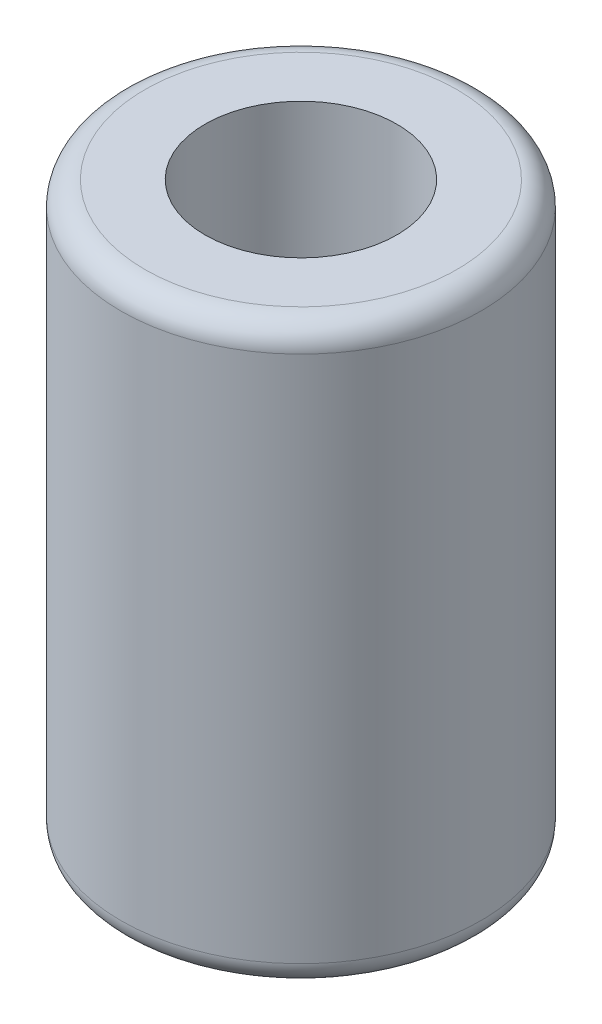
ISO-10303-21;
HEADER;
FILE_DESCRIPTION(('STEP AP214'),'2;1');
FILE_NAME('part.step','',(''),(''),'','','');
FILE_SCHEMA(('AUTOMOTIVE_DESIGN { 1 0 10303 214 1 1 1 1 }'));
ENDSEC;
DATA;
#1=APPLICATION_CONTEXT('core data for automotive mechanical design processes');
#2=APPLICATION_PROTOCOL_DEFINITION('international standard','automotive_design',2000,#1);
#3=PRODUCT_CONTEXT('',#1,'mechanical');
#4=PRODUCT('Part','Part','',(#3));
#5=PRODUCT_RELATED_PRODUCT_CATEGORY('part','',(#4));
#6=PRODUCT_DEFINITION_FORMATION('','',#4);
#7=PRODUCT_DEFINITION_CONTEXT('part definition',#1,'design');
#8=PRODUCT_DEFINITION('design','',#6,#7);
#9=PRODUCT_DEFINITION_SHAPE('','',#8);
#10=(LENGTH_UNIT() NAMED_UNIT(*) SI_UNIT(.MILLI.,.METRE.));
#11=(NAMED_UNIT(*) PLANE_ANGLE_UNIT() SI_UNIT($,.RADIAN.));
#12=(NAMED_UNIT(*) SI_UNIT($,.STERADIAN.) SOLID_ANGLE_UNIT());
#13=UNCERTAINTY_MEASURE_WITH_UNIT(LENGTH_MEASURE(1.E-05),#10,'distance_accuracy_value','');
#14=(GEOMETRIC_REPRESENTATION_CONTEXT(3) GLOBAL_UNCERTAINTY_ASSIGNED_CONTEXT((#13)) GLOBAL_UNIT_ASSIGNED_CONTEXT((#10,
#11,#12)) REPRESENTATION_CONTEXT('',''));
#15=CARTESIAN_POINT('',(0.,0.,0.));
#16=DIRECTION('',(0.,0.,1.));
#17=DIRECTION('',(1.,0.,0.));
#18=AXIS2_PLACEMENT_3D('',#15,#16,#17);
#19=CARTESIAN_POINT('',(0.,-12.,0.));
#20=DIRECTION('',(0.,1.,0.));
#21=DIRECTION('',(0.,0.,1.));
#22=AXIS2_PLACEMENT_3D('',#19,#20,#21);
#23=CYLINDRICAL_SURFACE('',#22,7.5);
#24=CARTESIAN_POINT('',(0.,-11.,0.));
#25=DIRECTION('',(0.,1.,0.));
#26=DIRECTION('',(0.,0.,1.));
#27=AXIS2_PLACEMENT_3D('',#24,#25,#26);
#28=CIRCLE('',#27,7.5);
#29=CARTESIAN_POINT('',(0.,-11.,7.5));
#30=VERTEX_POINT('',#29);
#31=EDGE_CURVE('E41',#30,#30,#28,.T.);
#32=ORIENTED_EDGE('',*,*,#31,.T.);
#33=EDGE_LOOP('',(#32));
#34=FACE_BOUND('',#33,.T.);
#35=CARTESIAN_POINT('',(0.,11.,0.));
#36=DIRECTION('',(0.,1.,0.));
#37=DIRECTION('',(0.,0.,1.));
#38=AXIS2_PLACEMENT_3D('',#35,#36,#37);
#39=CIRCLE('',#38,7.5);
#40=CARTESIAN_POINT('',(0.,11.,7.5));
#41=VERTEX_POINT('',#40);
#42=EDGE_CURVE('E45',#41,#41,#39,.F.);
#43=ORIENTED_EDGE('',*,*,#42,.T.);
#44=EDGE_LOOP('',(#43));
#45=FACE_BOUND('',#44,.T.);
#46=ADVANCED_FACE('F30',(#34,#45),#23,.T.);
#47=CARTESIAN_POINT('',(0.,-12.,0.));
#48=DIRECTION('',(0.,1.,0.));
#49=DIRECTION('',(0.,0.,1.));
#50=AXIS2_PLACEMENT_3D('',#47,#48,#49);
#51=PLANE('',#50);
#52=CARTESIAN_POINT('',(0.,-12.,0.));
#53=DIRECTION('',(0.,1.,0.));
#54=DIRECTION('',(0.,0.,1.));
#55=AXIS2_PLACEMENT_3D('',#52,#53,#54);
#56=CIRCLE('',#55,6.5);
#57=CARTESIAN_POINT('',(0.,-12.,6.5));
#58=VERTEX_POINT('',#57);
#59=EDGE_CURVE('E37',#58,#58,#56,.F.);
#60=ORIENTED_EDGE('',*,*,#59,.T.);
#61=EDGE_LOOP('',(#60));
#62=FACE_BOUND('',#61,.T.);
#63=CARTESIAN_POINT('',(0.,-12.,0.));
#64=DIRECTION('',(0.,1.,0.));
#65=DIRECTION('',(0.,0.,1.));
#66=AXIS2_PLACEMENT_3D('',#63,#64,#65);
#67=CIRCLE('',#66,4.);
#68=CARTESIAN_POINT('',(0.,-12.,4.));
#69=VERTEX_POINT('',#68);
#70=EDGE_CURVE('E50',#69,#69,#67,.T.);
#71=ORIENTED_EDGE('',*,*,#70,.T.);
#72=EDGE_LOOP('',(#71));
#73=FACE_BOUND('',#72,.T.);
#74=ADVANCED_FACE('F68',(#62,#73),#51,.F.);
#75=CARTESIAN_POINT('',(0.,-12.,0.));
#76=DIRECTION('',(0.,1.,0.));
#77=DIRECTION('',(0.,0.,1.));
#78=AXIS2_PLACEMENT_3D('',#75,#76,#77);
#79=CYLINDRICAL_SURFACE('',#78,4.);
#80=ORIENTED_EDGE('',*,*,#70,.F.);
#81=EDGE_LOOP('',(#80));
#82=FACE_BOUND('',#81,.T.);
#83=CARTESIAN_POINT('',(0.,12.,0.));
#84=DIRECTION('',(0.,1.,0.));
#85=DIRECTION('',(0.,0.,1.));
#86=AXIS2_PLACEMENT_3D('',#83,#84,#85);
#87=CIRCLE('',#86,4.);
#88=CARTESIAN_POINT('',(0.,12.,4.));
#89=VERTEX_POINT('',#88);
#90=EDGE_CURVE('E53',#89,#89,#87,.T.);
#91=ORIENTED_EDGE('',*,*,#90,.T.);
#92=EDGE_LOOP('',(#91));
#93=FACE_BOUND('',#92,.T.);
#94=ADVANCED_FACE('F57',(#82,#93),#79,.F.);
#95=CARTESIAN_POINT('',(0.,12.,0.));
#96=DIRECTION('',(0.,1.,0.));
#97=DIRECTION('',(0.,0.,1.));
#98=AXIS2_PLACEMENT_3D('',#95,#96,#97);
#99=PLANE('',#98);
#100=CARTESIAN_POINT('',(0.,12.,0.));
#101=DIRECTION('',(0.,1.,0.));
#102=DIRECTION('',(0.,0.,1.));
#103=AXIS2_PLACEMENT_3D('',#100,#101,#102);
#104=CIRCLE('',#103,6.5);
#105=CARTESIAN_POINT('',(0.,12.,6.5));
#106=VERTEX_POINT('',#105);
#107=EDGE_CURVE('E10',#106,#106,#104,.T.);
#108=ORIENTED_EDGE('',*,*,#107,.T.);
#109=EDGE_LOOP('',(#108));
#110=FACE_BOUND('',#109,.T.);
#111=ORIENTED_EDGE('',*,*,#90,.F.);
#112=EDGE_LOOP('',(#111));
#113=FACE_BOUND('',#112,.T.);
#114=ADVANCED_FACE('F59',(#110,#113),#99,.T.);
#115=CARTESIAN_POINT('',(0.,-11.,0.));
#116=DIRECTION('',(0.,1.,0.));
#117=DIRECTION('',(0.,0.,1.));
#118=AXIS2_PLACEMENT_3D('',#115,#116,#117);
#119=TOROIDAL_SURFACE('',#118,6.5,1.);
#120=ORIENTED_EDGE('',*,*,#59,.F.);
#121=EDGE_LOOP('',(#120));
#122=FACE_BOUND('',#121,.T.);
#123=ORIENTED_EDGE('',*,*,#31,.F.);
#124=EDGE_LOOP('',(#123));
#125=FACE_BOUND('',#124,.T.);
#126=ADVANCED_FACE('F61',(#122,#125),#119,.T.);
#127=CARTESIAN_POINT('',(0.,11.,0.));
#128=DIRECTION('',(0.,1.,0.));
#129=DIRECTION('',(0.,0.,1.));
#130=AXIS2_PLACEMENT_3D('',#127,#128,#129);
#131=TOROIDAL_SURFACE('',#130,6.5,1.);
#132=ORIENTED_EDGE('',*,*,#42,.F.);
#133=EDGE_LOOP('',(#132));
#134=FACE_BOUND('',#133,.T.);
#135=ORIENTED_EDGE('',*,*,#107,.F.);
#136=EDGE_LOOP('',(#135));
#137=FACE_BOUND('',#136,.T.);
#138=ADVANCED_FACE('F32',(#134,#137),#131,.T.);
#139=CLOSED_SHELL('',(#46,#74,#94,#114,#126,#138));
#140=MANIFOLD_SOLID_BREP('B2',#139);
#141=ADVANCED_BREP_SHAPE_REPRESENTATION('',(#18,#140),#14);
#142=SHAPE_DEFINITION_REPRESENTATION(#9,#141);
ENDSEC;
END-ISO-10303-21;
